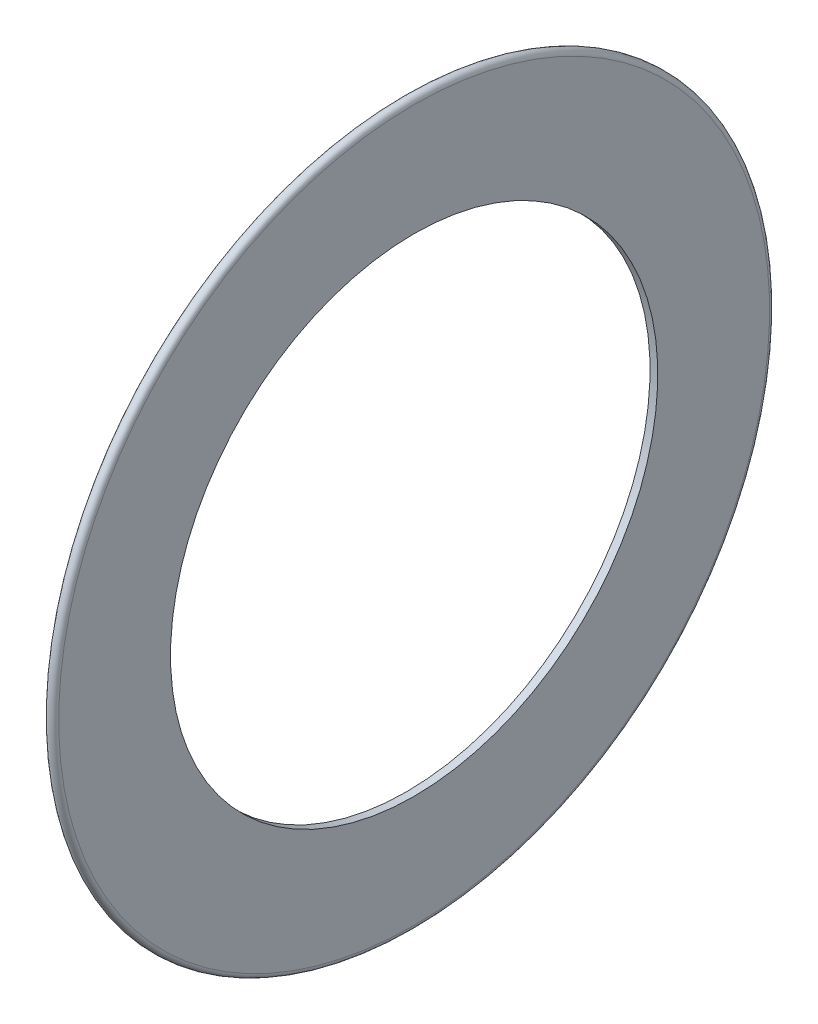
ISO-10303-21;
HEADER;
FILE_DESCRIPTION(('STEP AP214'),'2;1');
FILE_NAME('part.step','',(''),(''),'','','');
FILE_SCHEMA(('AUTOMOTIVE_DESIGN { 1 0 10303 214 1 1 1 1 }'));
ENDSEC;
DATA;
#1=APPLICATION_CONTEXT('core data for automotive mechanical design processes');
#2=APPLICATION_PROTOCOL_DEFINITION('international standard','automotive_design',2000,#1);
#3=PRODUCT_CONTEXT('',#1,'mechanical');
#4=PRODUCT('Part','Part','',(#3));
#5=PRODUCT_RELATED_PRODUCT_CATEGORY('part','',(#4));
#6=PRODUCT_DEFINITION_FORMATION('','',#4);
#7=PRODUCT_DEFINITION_CONTEXT('part definition',#1,'design');
#8=PRODUCT_DEFINITION('design','',#6,#7);
#9=PRODUCT_DEFINITION_SHAPE('','',#8);
#10=(LENGTH_UNIT() NAMED_UNIT(*) SI_UNIT(.MILLI.,.METRE.));
#11=(NAMED_UNIT(*) PLANE_ANGLE_UNIT() SI_UNIT($,.RADIAN.));
#12=(NAMED_UNIT(*) SI_UNIT($,.STERADIAN.) SOLID_ANGLE_UNIT());
#13=UNCERTAINTY_MEASURE_WITH_UNIT(LENGTH_MEASURE(1.E-05),#10,'distance_accuracy_value','');
#14=(GEOMETRIC_REPRESENTATION_CONTEXT(3) GLOBAL_UNCERTAINTY_ASSIGNED_CONTEXT((#13)) GLOBAL_UNIT_ASSIGNED_CONTEXT((#10,
#11,#12)) REPRESENTATION_CONTEXT('',''));
#15=CARTESIAN_POINT('',(0.,0.,0.));
#16=DIRECTION('',(0.,0.,1.));
#17=DIRECTION('',(1.,0.,0.));
#18=AXIS2_PLACEMENT_3D('',#15,#16,#17);
#19=CARTESIAN_POINT('',(0.36,0.,0.));
#20=DIRECTION('',(1.,0.,0.));
#21=DIRECTION('',(0.,0.,-1.));
#22=AXIS2_PLACEMENT_3D('',#19,#20,#21);
#23=TOROIDAL_SURFACE('',#22,12.4,0.18);
#24=CARTESIAN_POINT('',(0.18,0.,0.));
#25=DIRECTION('',(1.,0.,0.));
#26=DIRECTION('',(0.,1.,0.));
#27=AXIS2_PLACEMENT_3D('',#24,#25,#26);
#28=CIRCLE('',#27,12.4);
#29=CARTESIAN_POINT('',(0.18,12.4,0.));
#30=VERTEX_POINT('',#29);
#31=EDGE_CURVE('E11',#30,#30,#28,.T.);
#32=ORIENTED_EDGE('',*,*,#31,.T.);
#33=EDGE_LOOP('',(#32));
#34=FACE_BOUND('',#33,.T.);
#35=CARTESIAN_POINT('',(0.54,0.,0.));
#36=DIRECTION('',(1.,0.,0.));
#37=DIRECTION('',(0.,1.,0.));
#38=AXIS2_PLACEMENT_3D('',#35,#36,#37);
#39=CIRCLE('',#38,12.4);
#40=CARTESIAN_POINT('',(0.54,12.4,0.));
#41=VERTEX_POINT('',#40);
#42=EDGE_CURVE('E71',#41,#41,#39,.T.);
#43=ORIENTED_EDGE('',*,*,#42,.F.);
#44=EDGE_LOOP('',(#43));
#45=FACE_BOUND('',#44,.T.);
#46=ADVANCED_FACE('F41',(#34,#45),#23,.T.);
#47=CARTESIAN_POINT('',(0.27,0.,0.));
#48=DIRECTION('',(-1.,0.,0.));
#49=DIRECTION('',(0.,1.,0.));
#50=AXIS2_PLACEMENT_3D('',#47,#48,#49);
#51=CONICAL_SURFACE('',#50,12.31,0.785398163397445);
#52=CARTESIAN_POINT('',(0.36,0.,0.));
#53=DIRECTION('',(1.,0.,0.));
#54=DIRECTION('',(0.,1.,0.));
#55=AXIS2_PLACEMENT_3D('',#52,#53,#54);
#56=CIRCLE('',#55,12.22);
#57=CARTESIAN_POINT('',(0.36,12.22,0.));
#58=VERTEX_POINT('',#57);
#59=EDGE_CURVE('E51',#58,#58,#56,.T.);
#60=ORIENTED_EDGE('',*,*,#59,.T.);
#61=EDGE_LOOP('',(#60));
#62=FACE_BOUND('',#61,.T.);
#63=ORIENTED_EDGE('',*,*,#31,.F.);
#64=EDGE_LOOP('',(#63));
#65=FACE_BOUND('',#64,.T.);
#66=ADVANCED_FACE('F95',(#62,#65),#51,.F.);
#67=CARTESIAN_POINT('',(0.36,10.795,0.));
#68=DIRECTION('',(-1.,0.,0.));
#69=DIRECTION('',(0.,-1.,0.));
#70=AXIS2_PLACEMENT_3D('',#67,#68,#69);
#71=PLANE('',#70);
#72=CARTESIAN_POINT('',(0.36,0.,0.));
#73=DIRECTION('',(1.,0.,0.));
#74=DIRECTION('',(0.,1.,0.));
#75=AXIS2_PLACEMENT_3D('',#72,#73,#74);
#76=CIRCLE('',#75,9.37);
#77=CARTESIAN_POINT('',(0.36,9.37,0.));
#78=VERTEX_POINT('',#77);
#79=EDGE_CURVE('E44',#78,#78,#76,.T.);
#80=ORIENTED_EDGE('',*,*,#79,.T.);
#81=EDGE_LOOP('',(#80));
#82=FACE_BOUND('',#81,.T.);
#83=ORIENTED_EDGE('',*,*,#59,.F.);
#84=EDGE_LOOP('',(#83));
#85=FACE_BOUND('',#84,.T.);
#86=ADVANCED_FACE('F94',(#82,#85),#71,.T.);
#87=CARTESIAN_POINT('',(0.315,0.,0.));
#88=DIRECTION('',(1.,0.,0.));
#89=DIRECTION('',(0.,1.,0.));
#90=AXIS2_PLACEMENT_3D('',#87,#88,#89);
#91=CONICAL_SURFACE('',#90,9.325,0.785398163397454);
#92=CARTESIAN_POINT('',(0.27,0.,0.));
#93=DIRECTION('',(1.,0.,0.));
#94=DIRECTION('',(0.,1.,0.));
#95=AXIS2_PLACEMENT_3D('',#92,#93,#94);
#96=CIRCLE('',#95,9.28);
#97=CARTESIAN_POINT('',(0.27,9.28,0.));
#98=VERTEX_POINT('',#97);
#99=EDGE_CURVE('E85',#98,#98,#96,.T.);
#100=ORIENTED_EDGE('',*,*,#99,.T.);
#101=EDGE_LOOP('',(#100));
#102=FACE_BOUND('',#101,.T.);
#103=ORIENTED_EDGE('',*,*,#79,.F.);
#104=EDGE_LOOP('',(#103));
#105=FACE_BOUND('',#104,.T.);
#106=ADVANCED_FACE('F81',(#102,#105),#91,.T.);
#107=CARTESIAN_POINT('',(0.27,8.89,0.));
#108=DIRECTION('',(-1.,0.,0.));
#109=DIRECTION('',(0.,-1.,0.));
#110=AXIS2_PLACEMENT_3D('',#107,#108,#109);
#111=PLANE('',#110);
#112=CARTESIAN_POINT('',(0.27,0.,0.));
#113=DIRECTION('',(1.,0.,0.));
#114=DIRECTION('',(0.,1.,0.));
#115=AXIS2_PLACEMENT_3D('',#112,#113,#114);
#116=CIRCLE('',#115,8.5);
#117=CARTESIAN_POINT('',(0.27,8.5,0.));
#118=VERTEX_POINT('',#117);
#119=EDGE_CURVE('E76',#118,#118,#116,.T.);
#120=ORIENTED_EDGE('',*,*,#119,.T.);
#121=EDGE_LOOP('',(#120));
#122=FACE_BOUND('',#121,.T.);
#123=ORIENTED_EDGE('',*,*,#99,.F.);
#124=EDGE_LOOP('',(#123));
#125=FACE_BOUND('',#124,.T.);
#126=ADVANCED_FACE('F104',(#122,#125),#111,.T.);
#127=CARTESIAN_POINT('',(0.405,0.,0.));
#128=DIRECTION('',(-1.,0.,0.));
#129=DIRECTION('',(0.,1.,0.));
#130=AXIS2_PLACEMENT_3D('',#127,#128,#129);
#131=CYLINDRICAL_SURFACE('',#130,8.5);
#132=CARTESIAN_POINT('',(0.54,0.,0.));
#133=DIRECTION('',(1.,0.,0.));
#134=DIRECTION('',(0.,1.,0.));
#135=AXIS2_PLACEMENT_3D('',#132,#133,#134);
#136=CIRCLE('',#135,8.5);
#137=CARTESIAN_POINT('',(0.54,8.5,0.));
#138=VERTEX_POINT('',#137);
#139=EDGE_CURVE('E68',#138,#138,#136,.T.);
#140=ORIENTED_EDGE('',*,*,#139,.T.);
#141=EDGE_LOOP('',(#140));
#142=FACE_BOUND('',#141,.T.);
#143=ORIENTED_EDGE('',*,*,#119,.F.);
#144=EDGE_LOOP('',(#143));
#145=FACE_BOUND('',#144,.T.);
#146=ADVANCED_FACE('F43',(#142,#145),#131,.F.);
#147=CARTESIAN_POINT('',(0.54,10.45,0.));
#148=DIRECTION('',(1.,0.,0.));
#149=DIRECTION('',(0.,1.,0.));
#150=AXIS2_PLACEMENT_3D('',#147,#148,#149);
#151=PLANE('',#150);
#152=ORIENTED_EDGE('',*,*,#42,.T.);
#153=EDGE_LOOP('',(#152));
#154=FACE_BOUND('',#153,.T.);
#155=ORIENTED_EDGE('',*,*,#139,.F.);
#156=EDGE_LOOP('',(#155));
#157=FACE_BOUND('',#156,.T.);
#158=ADVANCED_FACE('F117',(#154,#157),#151,.T.);
#159=CLOSED_SHELL('',(#46,#66,#86,#106,#126,#146,#158));
#160=MANIFOLD_SOLID_BREP('B2',#159);
#161=ADVANCED_BREP_SHAPE_REPRESENTATION('',(#18,#160),#14);
#162=SHAPE_DEFINITION_REPRESENTATION(#9,#161);
ENDSEC;
END-ISO-10303-21;
